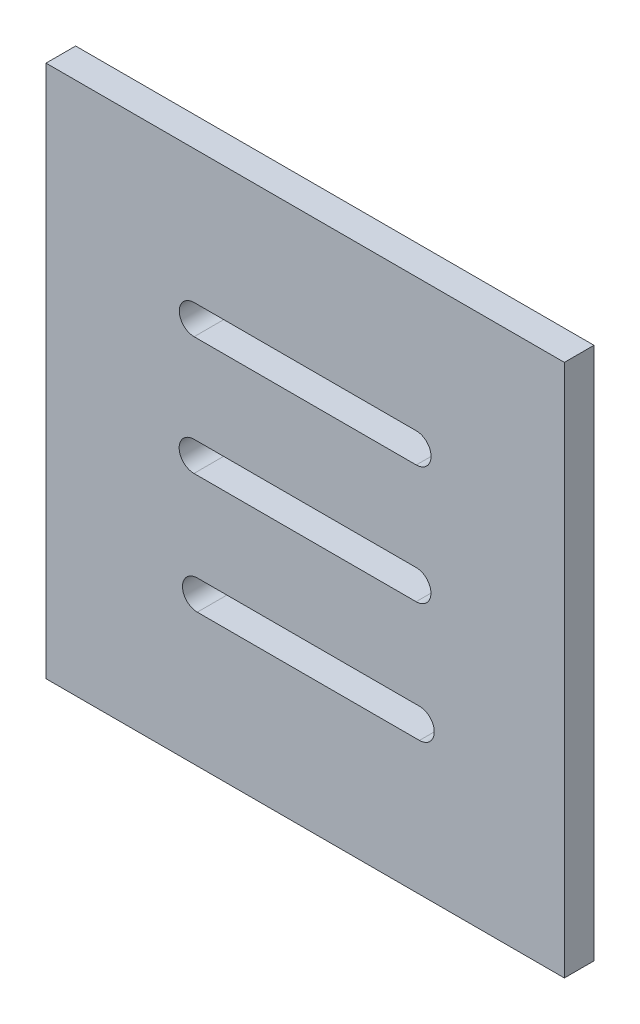
ISO-10303-21;
HEADER;
FILE_DESCRIPTION(('STEP AP214'),'2;1');
FILE_NAME('part.step','',(''),(''),'','','');
FILE_SCHEMA(('AUTOMOTIVE_DESIGN { 1 0 10303 214 1 1 1 1 }'));
ENDSEC;
DATA;
#1=APPLICATION_CONTEXT('core data for automotive mechanical design processes');
#2=APPLICATION_PROTOCOL_DEFINITION('international standard','automotive_design',2000,#1);
#3=PRODUCT_CONTEXT('',#1,'mechanical');
#4=PRODUCT('Part','Part','',(#3));
#5=PRODUCT_RELATED_PRODUCT_CATEGORY('part','',(#4));
#6=PRODUCT_DEFINITION_FORMATION('','',#4);
#7=PRODUCT_DEFINITION_CONTEXT('part definition',#1,'design');
#8=PRODUCT_DEFINITION('design','',#6,#7);
#9=PRODUCT_DEFINITION_SHAPE('','',#8);
#10=(LENGTH_UNIT() NAMED_UNIT(*) SI_UNIT(.MILLI.,.METRE.));
#11=(NAMED_UNIT(*) PLANE_ANGLE_UNIT() SI_UNIT($,.RADIAN.));
#12=(NAMED_UNIT(*) SI_UNIT($,.STERADIAN.) SOLID_ANGLE_UNIT());
#13=UNCERTAINTY_MEASURE_WITH_UNIT(LENGTH_MEASURE(1.E-05),#10,'distance_accuracy_value','');
#14=(GEOMETRIC_REPRESENTATION_CONTEXT(3) GLOBAL_UNCERTAINTY_ASSIGNED_CONTEXT((#13)) GLOBAL_UNIT_ASSIGNED_CONTEXT((#10,
#11,#12)) REPRESENTATION_CONTEXT('',''));
#15=CARTESIAN_POINT('',(0.,0.,0.));
#16=DIRECTION('',(0.,0.,1.));
#17=DIRECTION('',(1.,0.,0.));
#18=AXIS2_PLACEMENT_3D('',#15,#16,#17);
#19=CARTESIAN_POINT('',(17.5,18.,2.));
#20=DIRECTION('',(-1.,0.,0.));
#21=DIRECTION('',(0.,-1.,0.));
#22=AXIS2_PLACEMENT_3D('',#19,#20,#21);
#23=PLANE('',#22);
#24=DIRECTION('',(0.,1.,0.));
#25=VECTOR('',#24,1.);
#26=CARTESIAN_POINT('',(17.5,18.,0.));
#27=LINE('',#26,#25);
#28=CARTESIAN_POINT('',(17.5,-18.,0.));
#29=VERTEX_POINT('',#28);
#30=CARTESIAN_POINT('',(17.5,18.,0.));
#31=VERTEX_POINT('',#30);
#32=EDGE_CURVE('E246',#29,#31,#27,.T.);
#33=ORIENTED_EDGE('',*,*,#32,.T.);
#34=DIRECTION('',(0.,0.,-1.));
#35=VECTOR('',#34,1.);
#36=CARTESIAN_POINT('',(17.5,18.,2.));
#37=LINE('',#36,#35);
#38=CARTESIAN_POINT('',(17.5,18.,2.));
#39=VERTEX_POINT('',#38);
#40=EDGE_CURVE('E11',#39,#31,#37,.T.);
#41=ORIENTED_EDGE('',*,*,#40,.F.);
#42=DIRECTION('',(0.,1.,0.));
#43=VECTOR('',#42,1.);
#44=CARTESIAN_POINT('',(17.5,18.,2.));
#45=LINE('',#44,#43);
#46=CARTESIAN_POINT('',(17.5,-18.,2.));
#47=VERTEX_POINT('',#46);
#48=EDGE_CURVE('E247',#47,#39,#45,.T.);
#49=ORIENTED_EDGE('',*,*,#48,.F.);
#50=DIRECTION('',(0.,0.,-1.));
#51=VECTOR('',#50,1.);
#52=CARTESIAN_POINT('',(17.5,-18.,2.));
#53=LINE('',#52,#51);
#54=EDGE_CURVE('E257',#47,#29,#53,.T.);
#55=ORIENTED_EDGE('',*,*,#54,.T.);
#56=EDGE_LOOP('',(#33,#41,#49,#55));
#57=FACE_BOUND('',#56,.T.);
#58=ADVANCED_FACE('F35',(#57),#23,.F.);
#59=CARTESIAN_POINT('',(-17.5,18.,2.));
#60=DIRECTION('',(0.,-1.,0.));
#61=DIRECTION('',(0.,0.,-1.));
#62=AXIS2_PLACEMENT_3D('',#59,#60,#61);
#63=PLANE('',#62);
#64=DIRECTION('',(-1.,0.,0.));
#65=VECTOR('',#64,1.);
#66=CARTESIAN_POINT('',(-17.5,18.,0.));
#67=LINE('',#66,#65);
#68=CARTESIAN_POINT('',(-17.5,18.,0.));
#69=VERTEX_POINT('',#68);
#70=EDGE_CURVE('E260',#31,#69,#67,.T.);
#71=ORIENTED_EDGE('',*,*,#70,.T.);
#72=DIRECTION('',(0.,0.,-1.));
#73=VECTOR('',#72,1.);
#74=CARTESIAN_POINT('',(-17.5,18.,2.));
#75=LINE('',#74,#73);
#76=CARTESIAN_POINT('',(-17.5,18.,2.));
#77=VERTEX_POINT('',#76);
#78=EDGE_CURVE('E42',#77,#69,#75,.T.);
#79=ORIENTED_EDGE('',*,*,#78,.F.);
#80=DIRECTION('',(-1.,0.,0.));
#81=VECTOR('',#80,1.);
#82=CARTESIAN_POINT('',(-17.5,18.,2.));
#83=LINE('',#82,#81);
#84=EDGE_CURVE('E250',#39,#77,#83,.T.);
#85=ORIENTED_EDGE('',*,*,#84,.F.);
#86=ORIENTED_EDGE('',*,*,#40,.T.);
#87=EDGE_LOOP('',(#71,#79,#85,#86));
#88=FACE_BOUND('',#87,.T.);
#89=ADVANCED_FACE('F289',(#88),#63,.F.);
#90=CARTESIAN_POINT('',(-17.5,18.,2.));
#91=DIRECTION('',(1.,0.,0.));
#92=DIRECTION('',(0.,1.,0.));
#93=AXIS2_PLACEMENT_3D('',#90,#91,#92);
#94=PLANE('',#93);
#95=DIRECTION('',(0.,-1.,0.));
#96=VECTOR('',#95,1.);
#97=CARTESIAN_POINT('',(-17.5,18.,0.));
#98=LINE('',#97,#96);
#99=CARTESIAN_POINT('',(-17.5,-18.,0.));
#100=VERTEX_POINT('',#99);
#101=EDGE_CURVE('E262',#69,#100,#98,.T.);
#102=ORIENTED_EDGE('',*,*,#101,.T.);
#103=DIRECTION('',(0.,0.,-1.));
#104=VECTOR('',#103,1.);
#105=CARTESIAN_POINT('',(-17.5,-18.,2.));
#106=LINE('',#105,#104);
#107=CARTESIAN_POINT('',(-17.5,-18.,2.));
#108=VERTEX_POINT('',#107);
#109=EDGE_CURVE('E267',#108,#100,#106,.T.);
#110=ORIENTED_EDGE('',*,*,#109,.F.);
#111=DIRECTION('',(0.,-1.,0.));
#112=VECTOR('',#111,1.);
#113=CARTESIAN_POINT('',(-17.5,18.,2.));
#114=LINE('',#113,#112);
#115=EDGE_CURVE('E253',#77,#108,#114,.T.);
#116=ORIENTED_EDGE('',*,*,#115,.F.);
#117=ORIENTED_EDGE('',*,*,#78,.T.);
#118=EDGE_LOOP('',(#102,#110,#116,#117));
#119=FACE_BOUND('',#118,.T.);
#120=ADVANCED_FACE('F274',(#119),#94,.F.);
#121=CARTESIAN_POINT('',(-17.5,-18.,2.));
#122=DIRECTION('',(0.,1.,0.));
#123=DIRECTION('',(0.,0.,1.));
#124=AXIS2_PLACEMENT_3D('',#121,#122,#123);
#125=PLANE('',#124);
#126=DIRECTION('',(1.,0.,0.));
#127=VECTOR('',#126,1.);
#128=CARTESIAN_POINT('',(-17.5,-18.,0.));
#129=LINE('',#128,#127);
#130=EDGE_CURVE('E251',#100,#29,#129,.T.);
#131=ORIENTED_EDGE('',*,*,#130,.T.);
#132=ORIENTED_EDGE('',*,*,#54,.F.);
#133=DIRECTION('',(1.,0.,0.));
#134=VECTOR('',#133,1.);
#135=CARTESIAN_POINT('',(-17.5,-18.,2.));
#136=LINE('',#135,#134);
#137=EDGE_CURVE('E255',#108,#47,#136,.T.);
#138=ORIENTED_EDGE('',*,*,#137,.F.);
#139=ORIENTED_EDGE('',*,*,#109,.T.);
#140=EDGE_LOOP('',(#131,#132,#138,#139));
#141=FACE_BOUND('',#140,.T.);
#142=ADVANCED_FACE('F282',(#141),#125,.F.);
#143=CARTESIAN_POINT('',(0.,0.,2.));
#144=DIRECTION('',(0.,0.,1.));
#145=DIRECTION('',(1.,0.,0.));
#146=AXIS2_PLACEMENT_3D('',#143,#144,#145);
#147=PLANE('',#146);
#148=CARTESIAN_POINT('',(-7.50973997903368,0.,2.));
#149=DIRECTION('',(0.,0.,1.));
#150=DIRECTION('',(1.,0.,0.));
#151=AXIS2_PLACEMENT_3D('',#148,#149,#150);
#152=CIRCLE('',#151,1.);
#153=CARTESIAN_POINT('',(-7.50973997903368,1.,2.));
#154=VERTEX_POINT('',#153);
#155=CARTESIAN_POINT('',(-7.50973997903368,-0.999999999999997,2.));
#156=VERTEX_POINT('',#155);
#157=EDGE_CURVE('E49',#154,#156,#152,.T.);
#158=ORIENTED_EDGE('',*,*,#157,.F.);
#159=DIRECTION('',(-1.,0.,0.));
#160=VECTOR('',#159,1.);
#161=CARTESIAN_POINT('',(-7.50973997903368,1.,2.));
#162=LINE('',#161,#160);
#163=CARTESIAN_POINT('',(7.49026002096632,1.,2.));
#164=VERTEX_POINT('',#163);
#165=EDGE_CURVE('E155',#164,#154,#162,.T.);
#166=ORIENTED_EDGE('',*,*,#165,.F.);
#167=CARTESIAN_POINT('',(7.49026002096632,0.,2.));
#168=DIRECTION('',(0.,0.,1.));
#169=DIRECTION('',(1.,0.,0.));
#170=AXIS2_PLACEMENT_3D('',#167,#168,#169);
#171=CIRCLE('',#170,1.);
#172=CARTESIAN_POINT('',(7.49026002096632,-0.999999999999997,2.));
#173=VERTEX_POINT('',#172);
#174=EDGE_CURVE('E178',#173,#164,#171,.T.);
#175=ORIENTED_EDGE('',*,*,#174,.F.);
#176=DIRECTION('',(1.,0.,0.));
#177=VECTOR('',#176,1.);
#178=CARTESIAN_POINT('',(-7.50973997903368,-0.999999999999997,2.));
#179=LINE('',#178,#177);
#180=EDGE_CURVE('E171',#156,#173,#179,.T.);
#181=ORIENTED_EDGE('',*,*,#180,.F.);
#182=EDGE_LOOP('',(#158,#166,#175,#181));
#183=FACE_BOUND('',#182,.T.);
#184=CARTESIAN_POINT('',(-7.28533231625022,-8.,2.));
#185=DIRECTION('',(0.,0.,1.));
#186=DIRECTION('',(1.,0.,0.));
#187=AXIS2_PLACEMENT_3D('',#184,#185,#186);
#188=CIRCLE('',#187,0.999999999999999);
#189=CARTESIAN_POINT('',(-7.28533231625022,-7.,2.));
#190=VERTEX_POINT('',#189);
#191=CARTESIAN_POINT('',(-7.28533231625022,-9.,2.));
#192=VERTEX_POINT('',#191);
#193=EDGE_CURVE('E57',#190,#192,#188,.T.);
#194=ORIENTED_EDGE('',*,*,#193,.F.);
#195=DIRECTION('',(-1.,0.,0.));
#196=VECTOR('',#195,1.);
#197=CARTESIAN_POINT('',(-7.28533231625022,-7.,2.));
#198=LINE('',#197,#196);
#199=CARTESIAN_POINT('',(7.71466768374978,-7.,2.));
#200=VERTEX_POINT('',#199);
#201=EDGE_CURVE('E202',#200,#190,#198,.T.);
#202=ORIENTED_EDGE('',*,*,#201,.F.);
#203=CARTESIAN_POINT('',(7.71466768374978,-8.,2.));
#204=DIRECTION('',(0.,0.,1.));
#205=DIRECTION('',(1.,0.,0.));
#206=AXIS2_PLACEMENT_3D('',#203,#204,#205);
#207=CIRCLE('',#206,0.999999999999999);
#208=CARTESIAN_POINT('',(7.71466768374978,-9.,2.));
#209=VERTEX_POINT('',#208);
#210=EDGE_CURVE('E199',#209,#200,#207,.T.);
#211=ORIENTED_EDGE('',*,*,#210,.F.);
#212=DIRECTION('',(1.,0.,0.));
#213=VECTOR('',#212,1.);
#214=CARTESIAN_POINT('',(-7.28533231625022,-9.,2.));
#215=LINE('',#214,#213);
#216=EDGE_CURVE('E196',#192,#209,#215,.T.);
#217=ORIENTED_EDGE('',*,*,#216,.F.);
#218=EDGE_LOOP('',(#194,#202,#211,#217));
#219=FACE_BOUND('',#218,.T.);
#220=CARTESIAN_POINT('',(-7.50000000000001,8.,2.));
#221=DIRECTION('',(0.,0.,1.));
#222=DIRECTION('',(1.,0.,0.));
#223=AXIS2_PLACEMENT_3D('',#220,#221,#222);
#224=CIRCLE('',#223,1.);
#225=CARTESIAN_POINT('',(-7.50000000000001,9.00000000000001,2.));
#226=VERTEX_POINT('',#225);
#227=CARTESIAN_POINT('',(-7.50000000000001,7.,2.));
#228=VERTEX_POINT('',#227);
#229=EDGE_CURVE('E223',#226,#228,#224,.T.);
#230=ORIENTED_EDGE('',*,*,#229,.F.);
#231=DIRECTION('',(-1.,0.,0.));
#232=VECTOR('',#231,1.);
#233=CARTESIAN_POINT('',(-7.50000000000001,9.00000000000001,2.));
#234=LINE('',#233,#232);
#235=CARTESIAN_POINT('',(7.49999999999999,9.00000000000001,2.));
#236=VERTEX_POINT('',#235);
#237=EDGE_CURVE('E231',#236,#226,#234,.T.);
#238=ORIENTED_EDGE('',*,*,#237,.F.);
#239=CARTESIAN_POINT('',(7.49999999999999,8.00000000000001,2.));
#240=DIRECTION('',(0.,0.,1.));
#241=DIRECTION('',(1.,0.,0.));
#242=AXIS2_PLACEMENT_3D('',#239,#240,#241);
#243=CIRCLE('',#242,1.);
#244=CARTESIAN_POINT('',(7.49999999999999,7.00000000000001,2.));
#245=VERTEX_POINT('',#244);
#246=EDGE_CURVE('E228',#245,#236,#243,.T.);
#247=ORIENTED_EDGE('',*,*,#246,.F.);
#248=DIRECTION('',(1.,0.,0.));
#249=VECTOR('',#248,1.);
#250=CARTESIAN_POINT('',(-7.50000000000001,7.,2.));
#251=LINE('',#250,#249);
#252=EDGE_CURVE('E225',#228,#245,#251,.T.);
#253=ORIENTED_EDGE('',*,*,#252,.F.);
#254=EDGE_LOOP('',(#230,#238,#247,#253));
#255=FACE_BOUND('',#254,.T.);
#256=ORIENTED_EDGE('',*,*,#48,.T.);
#257=ORIENTED_EDGE('',*,*,#84,.T.);
#258=ORIENTED_EDGE('',*,*,#115,.T.);
#259=ORIENTED_EDGE('',*,*,#137,.T.);
#260=EDGE_LOOP('',(#256,#257,#258,#259));
#261=FACE_BOUND('',#260,.T.);
#262=ADVANCED_FACE('F288',(#183,#219,#255,#261),#147,.T.);
#263=CARTESIAN_POINT('',(0.,0.,0.));
#264=DIRECTION('',(0.,0.,1.));
#265=DIRECTION('',(1.,0.,0.));
#266=AXIS2_PLACEMENT_3D('',#263,#264,#265);
#267=PLANE('',#266);
#268=DIRECTION('',(1.,0.,0.));
#269=VECTOR('',#268,1.);
#270=CARTESIAN_POINT('',(-7.50973997903368,1.,0.));
#271=LINE('',#270,#269);
#272=CARTESIAN_POINT('',(-7.50973997903368,1.,0.));
#273=VERTEX_POINT('',#272);
#274=CARTESIAN_POINT('',(7.49026002096632,1.,0.));
#275=VERTEX_POINT('',#274);
#276=EDGE_CURVE('E169',#273,#275,#271,.T.);
#277=ORIENTED_EDGE('',*,*,#276,.F.);
#278=CARTESIAN_POINT('',(-7.50973997903368,0.,0.));
#279=DIRECTION('',(0.,0.,1.));
#280=DIRECTION('',(1.,0.,0.));
#281=AXIS2_PLACEMENT_3D('',#278,#279,#280);
#282=CIRCLE('',#281,1.);
#283=CARTESIAN_POINT('',(-7.50973997903368,-0.999999999999997,0.));
#284=VERTEX_POINT('',#283);
#285=EDGE_CURVE('E149',#284,#273,#282,.F.);
#286=ORIENTED_EDGE('',*,*,#285,.F.);
#287=DIRECTION('',(-1.,0.,0.));
#288=VECTOR('',#287,1.);
#289=CARTESIAN_POINT('',(-7.50973997903368,-0.999999999999997,0.));
#290=LINE('',#289,#288);
#291=CARTESIAN_POINT('',(7.49026002096632,-0.999999999999997,0.));
#292=VERTEX_POINT('',#291);
#293=EDGE_CURVE('E159',#292,#284,#290,.T.);
#294=ORIENTED_EDGE('',*,*,#293,.F.);
#295=CARTESIAN_POINT('',(7.49026002096632,0.,0.));
#296=DIRECTION('',(0.,0.,1.));
#297=DIRECTION('',(1.,0.,0.));
#298=AXIS2_PLACEMENT_3D('',#295,#296,#297);
#299=CIRCLE('',#298,1.);
#300=EDGE_CURVE('E173',#275,#292,#299,.F.);
#301=ORIENTED_EDGE('',*,*,#300,.F.);
#302=EDGE_LOOP('',(#277,#286,#294,#301));
#303=FACE_BOUND('',#302,.T.);
#304=DIRECTION('',(1.,0.,0.));
#305=VECTOR('',#304,1.);
#306=CARTESIAN_POINT('',(-7.28533231625022,-7.,0.));
#307=LINE('',#306,#305);
#308=CARTESIAN_POINT('',(-7.28533231625022,-7.,0.));
#309=VERTEX_POINT('',#308);
#310=CARTESIAN_POINT('',(7.71466768374978,-7.,0.));
#311=VERTEX_POINT('',#310);
#312=EDGE_CURVE('E189',#309,#311,#307,.T.);
#313=ORIENTED_EDGE('',*,*,#312,.F.);
#314=CARTESIAN_POINT('',(-7.28533231625022,-8.,0.));
#315=DIRECTION('',(0.,0.,1.));
#316=DIRECTION('',(1.,0.,0.));
#317=AXIS2_PLACEMENT_3D('',#314,#315,#316);
#318=CIRCLE('',#317,0.999999999999999);
#319=CARTESIAN_POINT('',(-7.28533231625022,-9.,0.));
#320=VERTEX_POINT('',#319);
#321=EDGE_CURVE('E192',#320,#309,#318,.F.);
#322=ORIENTED_EDGE('',*,*,#321,.F.);
#323=DIRECTION('',(-1.,0.,0.));
#324=VECTOR('',#323,1.);
#325=CARTESIAN_POINT('',(-7.28533231625022,-9.,0.));
#326=LINE('',#325,#324);
#327=CARTESIAN_POINT('',(7.71466768374978,-9.,0.));
#328=VERTEX_POINT('',#327);
#329=EDGE_CURVE('E208',#328,#320,#326,.T.);
#330=ORIENTED_EDGE('',*,*,#329,.F.);
#331=CARTESIAN_POINT('',(7.71466768374978,-8.,0.));
#332=DIRECTION('',(0.,0.,1.));
#333=DIRECTION('',(1.,0.,0.));
#334=AXIS2_PLACEMENT_3D('',#331,#332,#333);
#335=CIRCLE('',#334,0.999999999999999);
#336=EDGE_CURVE('E187',#311,#328,#335,.F.);
#337=ORIENTED_EDGE('',*,*,#336,.F.);
#338=EDGE_LOOP('',(#313,#322,#330,#337));
#339=FACE_BOUND('',#338,.T.);
#340=DIRECTION('',(1.,0.,0.));
#341=VECTOR('',#340,1.);
#342=CARTESIAN_POINT('',(-7.50000000000001,9.00000000000001,0.));
#343=LINE('',#342,#341);
#344=CARTESIAN_POINT('',(-7.50000000000001,9.00000000000001,0.));
#345=VERTEX_POINT('',#344);
#346=CARTESIAN_POINT('',(7.49999999999999,9.00000000000001,0.));
#347=VERTEX_POINT('',#346);
#348=EDGE_CURVE('E217',#345,#347,#343,.T.);
#349=ORIENTED_EDGE('',*,*,#348,.F.);
#350=CARTESIAN_POINT('',(-7.50000000000001,8.,0.));
#351=DIRECTION('',(0.,0.,1.));
#352=DIRECTION('',(1.,0.,0.));
#353=AXIS2_PLACEMENT_3D('',#350,#351,#352);
#354=CIRCLE('',#353,1.);
#355=CARTESIAN_POINT('',(-7.50000000000001,7.,0.));
#356=VERTEX_POINT('',#355);
#357=EDGE_CURVE('E220',#356,#345,#354,.F.);
#358=ORIENTED_EDGE('',*,*,#357,.F.);
#359=DIRECTION('',(-1.,0.,0.));
#360=VECTOR('',#359,1.);
#361=CARTESIAN_POINT('',(-7.50000000000001,7.,0.));
#362=LINE('',#361,#360);
#363=CARTESIAN_POINT('',(7.49999999999999,7.00000000000001,0.));
#364=VERTEX_POINT('',#363);
#365=EDGE_CURVE('E237',#364,#356,#362,.T.);
#366=ORIENTED_EDGE('',*,*,#365,.F.);
#367=CARTESIAN_POINT('',(7.49999999999999,8.00000000000001,0.));
#368=DIRECTION('',(0.,0.,1.));
#369=DIRECTION('',(1.,0.,0.));
#370=AXIS2_PLACEMENT_3D('',#367,#368,#369);
#371=CIRCLE('',#370,1.);
#372=EDGE_CURVE('E163',#347,#364,#371,.F.);
#373=ORIENTED_EDGE('',*,*,#372,.F.);
#374=EDGE_LOOP('',(#349,#358,#366,#373));
#375=FACE_BOUND('',#374,.T.);
#376=ORIENTED_EDGE('',*,*,#32,.F.);
#377=ORIENTED_EDGE('',*,*,#130,.F.);
#378=ORIENTED_EDGE('',*,*,#101,.F.);
#379=ORIENTED_EDGE('',*,*,#70,.F.);
#380=EDGE_LOOP('',(#376,#377,#378,#379));
#381=FACE_BOUND('',#380,.T.);
#382=ADVANCED_FACE('F166',(#303,#339,#375,#381),#267,.F.);
#383=CARTESIAN_POINT('',(-7.50000000000001,8.,-0.00100000000000013));
#384=DIRECTION('',(0.,0.,1.));
#385=DIRECTION('',(1.,0.,0.));
#386=AXIS2_PLACEMENT_3D('',#383,#384,#385);
#387=CYLINDRICAL_SURFACE('',#386,1.);
#388=ORIENTED_EDGE('',*,*,#357,.T.);
#389=DIRECTION('',(0.,0.,1.));
#390=VECTOR('',#389,1.);
#391=CARTESIAN_POINT('',(-7.50000000000001,9.00000000000001,-0.00100000000000013));
#392=LINE('',#391,#390);
#393=EDGE_CURVE('E235',#345,#226,#392,.T.);
#394=ORIENTED_EDGE('',*,*,#393,.T.);
#395=ORIENTED_EDGE('',*,*,#229,.T.);
#396=DIRECTION('',(0.,0.,1.));
#397=VECTOR('',#396,1.);
#398=CARTESIAN_POINT('',(-7.50000000000001,7.,-0.00100000000000013));
#399=LINE('',#398,#397);
#400=EDGE_CURVE('E234',#356,#228,#399,.T.);
#401=ORIENTED_EDGE('',*,*,#400,.F.);
#402=EDGE_LOOP('',(#388,#394,#395,#401));
#403=FACE_BOUND('',#402,.T.);
#404=ADVANCED_FACE('F301',(#403),#387,.F.);
#405=CARTESIAN_POINT('',(-7.50000000000001,9.00000000000001,-0.00100000000000013));
#406=DIRECTION('',(0.,1.,0.));
#407=DIRECTION('',(0.,0.,1.));
#408=AXIS2_PLACEMENT_3D('',#405,#406,#407);
#409=PLANE('',#408);
#410=ORIENTED_EDGE('',*,*,#348,.T.);
#411=DIRECTION('',(0.,0.,1.));
#412=VECTOR('',#411,1.);
#413=CARTESIAN_POINT('',(7.49999999999999,9.00000000000001,-0.00100000000000013));
#414=LINE('',#413,#412);
#415=EDGE_CURVE('E238',#347,#236,#414,.T.);
#416=ORIENTED_EDGE('',*,*,#415,.T.);
#417=ORIENTED_EDGE('',*,*,#237,.T.);
#418=ORIENTED_EDGE('',*,*,#393,.F.);
#419=EDGE_LOOP('',(#410,#416,#417,#418));
#420=FACE_BOUND('',#419,.T.);
#421=ADVANCED_FACE('F307',(#420),#409,.F.);
#422=CARTESIAN_POINT('',(7.49999999999999,8.00000000000001,-0.00100000000000013));
#423=DIRECTION('',(0.,0.,1.));
#424=DIRECTION('',(1.,0.,0.));
#425=AXIS2_PLACEMENT_3D('',#422,#423,#424);
#426=CYLINDRICAL_SURFACE('',#425,1.);
#427=ORIENTED_EDGE('',*,*,#372,.T.);
#428=DIRECTION('',(0.,0.,1.));
#429=VECTOR('',#428,1.);
#430=CARTESIAN_POINT('',(7.49999999999999,7.00000000000001,-0.00100000000000013));
#431=LINE('',#430,#429);
#432=EDGE_CURVE('E240',#364,#245,#431,.T.);
#433=ORIENTED_EDGE('',*,*,#432,.T.);
#434=ORIENTED_EDGE('',*,*,#246,.T.);
#435=ORIENTED_EDGE('',*,*,#415,.F.);
#436=EDGE_LOOP('',(#427,#433,#434,#435));
#437=FACE_BOUND('',#436,.T.);
#438=ADVANCED_FACE('F313',(#437),#426,.F.);
#439=CARTESIAN_POINT('',(-7.50000000000001,7.,-0.00100000000000013));
#440=DIRECTION('',(0.,-1.,0.));
#441=DIRECTION('',(1.,0.,0.));
#442=AXIS2_PLACEMENT_3D('',#439,#440,#441);
#443=PLANE('',#442);
#444=ORIENTED_EDGE('',*,*,#365,.T.);
#445=ORIENTED_EDGE('',*,*,#400,.T.);
#446=ORIENTED_EDGE('',*,*,#252,.T.);
#447=ORIENTED_EDGE('',*,*,#432,.F.);
#448=EDGE_LOOP('',(#444,#445,#446,#447));
#449=FACE_BOUND('',#448,.T.);
#450=ADVANCED_FACE('F309',(#449),#443,.F.);
#451=CARTESIAN_POINT('',(-7.28533231625022,-8.,-0.00100000000000013));
#452=DIRECTION('',(0.,0.,1.));
#453=DIRECTION('',(1.,0.,0.));
#454=AXIS2_PLACEMENT_3D('',#451,#452,#453);
#455=CYLINDRICAL_SURFACE('',#454,0.999999999999999);
#456=ORIENTED_EDGE('',*,*,#321,.T.);
#457=DIRECTION('',(0.,0.,1.));
#458=VECTOR('',#457,1.);
#459=CARTESIAN_POINT('',(-7.28533231625022,-7.,-0.00100000000000013));
#460=LINE('',#459,#458);
#461=EDGE_CURVE('E206',#309,#190,#460,.T.);
#462=ORIENTED_EDGE('',*,*,#461,.T.);
#463=ORIENTED_EDGE('',*,*,#193,.T.);
#464=DIRECTION('',(0.,0.,1.));
#465=VECTOR('',#464,1.);
#466=CARTESIAN_POINT('',(-7.28533231625022,-9.,-0.00100000000000013));
#467=LINE('',#466,#465);
#468=EDGE_CURVE('E205',#320,#192,#467,.T.);
#469=ORIENTED_EDGE('',*,*,#468,.F.);
#470=EDGE_LOOP('',(#456,#462,#463,#469));
#471=FACE_BOUND('',#470,.T.);
#472=ADVANCED_FACE('F312',(#471),#455,.F.);
#473=CARTESIAN_POINT('',(-7.28533231625022,-7.,-0.00100000000000013));
#474=DIRECTION('',(0.,1.,0.));
#475=DIRECTION('',(0.,0.,1.));
#476=AXIS2_PLACEMENT_3D('',#473,#474,#475);
#477=PLANE('',#476);
#478=ORIENTED_EDGE('',*,*,#312,.T.);
#479=DIRECTION('',(0.,0.,1.));
#480=VECTOR('',#479,1.);
#481=CARTESIAN_POINT('',(7.71466768374978,-7.,-0.00100000000000013));
#482=LINE('',#481,#480);
#483=EDGE_CURVE('E209',#311,#200,#482,.T.);
#484=ORIENTED_EDGE('',*,*,#483,.T.);
#485=ORIENTED_EDGE('',*,*,#201,.T.);
#486=ORIENTED_EDGE('',*,*,#461,.F.);
#487=EDGE_LOOP('',(#478,#484,#485,#486));
#488=FACE_BOUND('',#487,.T.);
#489=ADVANCED_FACE('F323',(#488),#477,.F.);
#490=CARTESIAN_POINT('',(7.71466768374978,-8.,-0.00100000000000013));
#491=DIRECTION('',(0.,0.,1.));
#492=DIRECTION('',(1.,0.,0.));
#493=AXIS2_PLACEMENT_3D('',#490,#491,#492);
#494=CYLINDRICAL_SURFACE('',#493,0.999999999999999);
#495=ORIENTED_EDGE('',*,*,#336,.T.);
#496=DIRECTION('',(0.,0.,1.));
#497=VECTOR('',#496,1.);
#498=CARTESIAN_POINT('',(7.71466768374978,-9.,-0.00100000000000013));
#499=LINE('',#498,#497);
#500=EDGE_CURVE('E211',#328,#209,#499,.T.);
#501=ORIENTED_EDGE('',*,*,#500,.T.);
#502=ORIENTED_EDGE('',*,*,#210,.T.);
#503=ORIENTED_EDGE('',*,*,#483,.F.);
#504=EDGE_LOOP('',(#495,#501,#502,#503));
#505=FACE_BOUND('',#504,.T.);
#506=ADVANCED_FACE('F327',(#505),#494,.F.);
#507=CARTESIAN_POINT('',(-7.28533231625022,-9.,-0.00100000000000013));
#508=DIRECTION('',(0.,-1.,0.));
#509=DIRECTION('',(0.,0.,-1.));
#510=AXIS2_PLACEMENT_3D('',#507,#508,#509);
#511=PLANE('',#510);
#512=ORIENTED_EDGE('',*,*,#329,.T.);
#513=ORIENTED_EDGE('',*,*,#468,.T.);
#514=ORIENTED_EDGE('',*,*,#216,.T.);
#515=ORIENTED_EDGE('',*,*,#500,.F.);
#516=EDGE_LOOP('',(#512,#513,#514,#515));
#517=FACE_BOUND('',#516,.T.);
#518=ADVANCED_FACE('F324',(#517),#511,.F.);
#519=CARTESIAN_POINT('',(-7.50973997903368,0.,-0.00100000000000013));
#520=DIRECTION('',(0.,0.,1.));
#521=DIRECTION('',(1.,0.,0.));
#522=AXIS2_PLACEMENT_3D('',#519,#520,#521);
#523=CYLINDRICAL_SURFACE('',#522,1.);
#524=ORIENTED_EDGE('',*,*,#285,.T.);
#525=DIRECTION('',(0.,0.,1.));
#526=VECTOR('',#525,1.);
#527=CARTESIAN_POINT('',(-7.50973997903368,1.,-0.00100000000000013));
#528=LINE('',#527,#526);
#529=EDGE_CURVE('E164',#273,#154,#528,.T.);
#530=ORIENTED_EDGE('',*,*,#529,.T.);
#531=ORIENTED_EDGE('',*,*,#157,.T.);
#532=DIRECTION('',(0.,0.,1.));
#533=VECTOR('',#532,1.);
#534=CARTESIAN_POINT('',(-7.50973997903368,-0.999999999999997,-0.00100000000000013));
#535=LINE('',#534,#533);
#536=EDGE_CURVE('E145',#284,#156,#535,.T.);
#537=ORIENTED_EDGE('',*,*,#536,.F.);
#538=EDGE_LOOP('',(#524,#530,#531,#537));
#539=FACE_BOUND('',#538,.T.);
#540=ADVANCED_FACE('F147',(#539),#523,.F.);
#541=CARTESIAN_POINT('',(-7.50973997903368,1.,-0.00100000000000013));
#542=DIRECTION('',(0.,1.,0.));
#543=DIRECTION('',(0.,0.,1.));
#544=AXIS2_PLACEMENT_3D('',#541,#542,#543);
#545=PLANE('',#544);
#546=ORIENTED_EDGE('',*,*,#276,.T.);
#547=DIRECTION('',(0.,0.,1.));
#548=VECTOR('',#547,1.);
#549=CARTESIAN_POINT('',(7.49026002096632,1.,-0.00100000000000013));
#550=LINE('',#549,#548);
#551=EDGE_CURVE('E184',#275,#164,#550,.T.);
#552=ORIENTED_EDGE('',*,*,#551,.T.);
#553=ORIENTED_EDGE('',*,*,#165,.T.);
#554=ORIENTED_EDGE('',*,*,#529,.F.);
#555=EDGE_LOOP('',(#546,#552,#553,#554));
#556=FACE_BOUND('',#555,.T.);
#557=ADVANCED_FACE('F337',(#556),#545,.F.);
#558=CARTESIAN_POINT('',(7.49026002096632,0.,-0.00100000000000013));
#559=DIRECTION('',(0.,0.,1.));
#560=DIRECTION('',(1.,0.,0.));
#561=AXIS2_PLACEMENT_3D('',#558,#559,#560);
#562=CYLINDRICAL_SURFACE('',#561,1.);
#563=ORIENTED_EDGE('',*,*,#300,.T.);
#564=DIRECTION('',(0.,0.,1.));
#565=VECTOR('',#564,1.);
#566=CARTESIAN_POINT('',(7.49026002096632,-0.999999999999997,-0.00100000000000013));
#567=LINE('',#566,#565);
#568=EDGE_CURVE('E154',#292,#173,#567,.T.);
#569=ORIENTED_EDGE('',*,*,#568,.T.);
#570=ORIENTED_EDGE('',*,*,#174,.T.);
#571=ORIENTED_EDGE('',*,*,#551,.F.);
#572=EDGE_LOOP('',(#563,#569,#570,#571));
#573=FACE_BOUND('',#572,.T.);
#574=ADVANCED_FACE('F340',(#573),#562,.F.);
#575=CARTESIAN_POINT('',(-7.50973997903368,-0.999999999999997,-0.00100000000000013));
#576=DIRECTION('',(0.,-1.,0.));
#577=DIRECTION('',(0.,0.,-1.));
#578=AXIS2_PLACEMENT_3D('',#575,#576,#577);
#579=PLANE('',#578);
#580=ORIENTED_EDGE('',*,*,#293,.T.);
#581=ORIENTED_EDGE('',*,*,#536,.T.);
#582=ORIENTED_EDGE('',*,*,#180,.T.);
#583=ORIENTED_EDGE('',*,*,#568,.F.);
#584=EDGE_LOOP('',(#580,#581,#582,#583));
#585=FACE_BOUND('',#584,.T.);
#586=ADVANCED_FACE('F160',(#585),#579,.F.);
#587=CLOSED_SHELL('',(#58,#89,#120,#142,#262,#382,#404,#421,#438,#450,#472,#489,#506,#518,#540,
#557,#574,#586));
#588=MANIFOLD_SOLID_BREP('B2',#587);
#589=ADVANCED_BREP_SHAPE_REPRESENTATION('',(#18,#588),#14);
#590=SHAPE_DEFINITION_REPRESENTATION(#9,#589);
ENDSEC;
END-ISO-10303-21;
